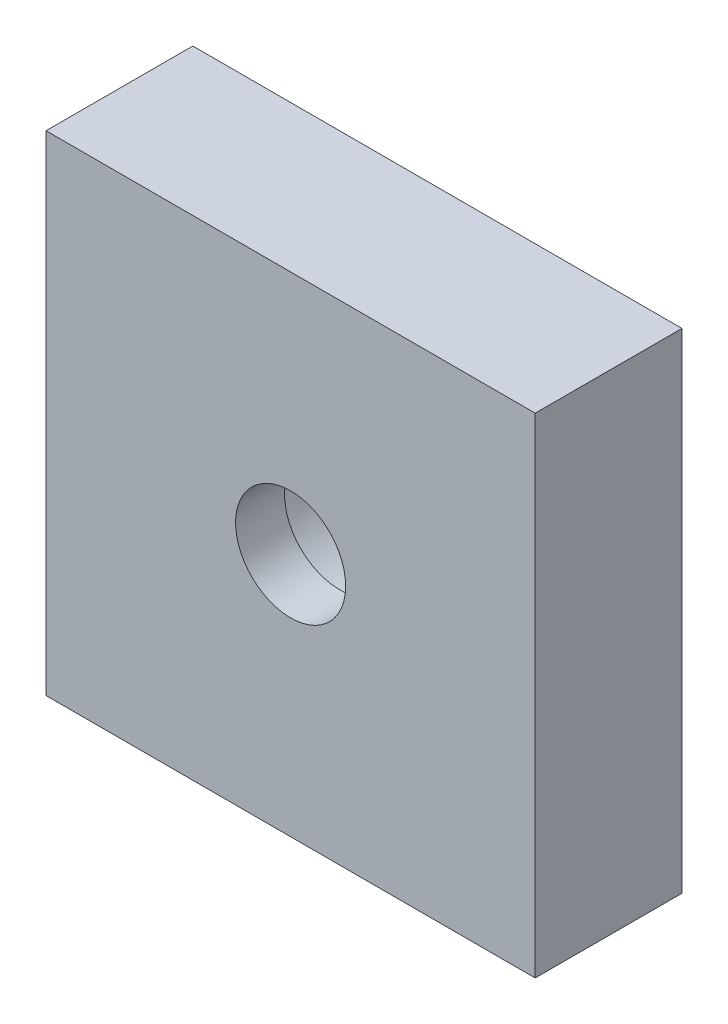
ISO-10303-21;
HEADER;
FILE_DESCRIPTION(('STEP AP214'),'2;1');
FILE_NAME('part.step','',(''),(''),'','','');
FILE_SCHEMA(('AUTOMOTIVE_DESIGN { 1 0 10303 214 1 1 1 1 }'));
ENDSEC;
DATA;
#1=APPLICATION_CONTEXT('core data for automotive mechanical design processes');
#2=APPLICATION_PROTOCOL_DEFINITION('international standard','automotive_design',2000,#1);
#3=PRODUCT_CONTEXT('',#1,'mechanical');
#4=PRODUCT('Part','Part','',(#3));
#5=PRODUCT_RELATED_PRODUCT_CATEGORY('part','',(#4));
#6=PRODUCT_DEFINITION_FORMATION('','',#4);
#7=PRODUCT_DEFINITION_CONTEXT('part definition',#1,'design');
#8=PRODUCT_DEFINITION('design','',#6,#7);
#9=PRODUCT_DEFINITION_SHAPE('','',#8);
#10=(LENGTH_UNIT() NAMED_UNIT(*) SI_UNIT(.MILLI.,.METRE.));
#11=(NAMED_UNIT(*) PLANE_ANGLE_UNIT() SI_UNIT($,.RADIAN.));
#12=(NAMED_UNIT(*) SI_UNIT($,.STERADIAN.) SOLID_ANGLE_UNIT());
#13=UNCERTAINTY_MEASURE_WITH_UNIT(LENGTH_MEASURE(1.E-05),#10,'distance_accuracy_value','');
#14=(GEOMETRIC_REPRESENTATION_CONTEXT(3) GLOBAL_UNCERTAINTY_ASSIGNED_CONTEXT((#13)) GLOBAL_UNIT_ASSIGNED_CONTEXT((#10,
#11,#12)) REPRESENTATION_CONTEXT('',''));
#15=CARTESIAN_POINT('',(0.,0.,0.));
#16=DIRECTION('',(0.,0.,1.));
#17=DIRECTION('',(1.,0.,0.));
#18=AXIS2_PLACEMENT_3D('',#15,#16,#17);
#19=CARTESIAN_POINT('',(10.,10.,10.0049));
#20=DIRECTION('',(0.,0.,1.));
#21=DIRECTION('',(1.,0.,0.));
#22=AXIS2_PLACEMENT_3D('',#19,#20,#21);
#23=PLANE('',#22);
#24=CARTESIAN_POINT('',(10.,10.,10.0049));
#25=DIRECTION('',(0.,0.,1.));
#26=DIRECTION('',(1.,0.,0.));
#27=AXIS2_PLACEMENT_3D('',#24,#25,#26);
#28=CIRCLE('',#27,3.);
#29=CARTESIAN_POINT('',(13.,10.,10.0049));
#30=VERTEX_POINT('',#29);
#31=EDGE_CURVE('E19',#30,#30,#28,.F.);
#32=ORIENTED_EDGE('',*,*,#31,.T.);
#33=EDGE_LOOP('',(#32));
#34=FACE_BOUND('',#33,.T.);
#35=ADVANCED_FACE('F16',(#34),#23,.F.);
#36=CARTESIAN_POINT('',(30.,10.,10.0049));
#37=DIRECTION('',(0.,0.,1.));
#38=DIRECTION('',(1.,0.,0.));
#39=AXIS2_PLACEMENT_3D('',#36,#37,#38);
#40=PLANE('',#39);
#41=CARTESIAN_POINT('',(30.,10.,10.0049));
#42=DIRECTION('',(0.,0.,1.));
#43=DIRECTION('',(1.,0.,0.));
#44=AXIS2_PLACEMENT_3D('',#41,#42,#43);
#45=CIRCLE('',#44,3.);
#46=CARTESIAN_POINT('',(33.,10.,10.0049));
#47=VERTEX_POINT('',#46);
#48=EDGE_CURVE('E109',#47,#47,#45,.F.);
#49=ORIENTED_EDGE('',*,*,#48,.T.);
#50=EDGE_LOOP('',(#49));
#51=FACE_BOUND('',#50,.T.);
#52=ADVANCED_FACE('F181',(#51),#40,.F.);
#53=CARTESIAN_POINT('',(10.,30.,10.0049));
#54=DIRECTION('',(0.,0.,1.));
#55=DIRECTION('',(1.,0.,0.));
#56=AXIS2_PLACEMENT_3D('',#53,#54,#55);
#57=PLANE('',#56);
#58=CARTESIAN_POINT('',(10.,30.,10.0049));
#59=DIRECTION('',(0.,0.,1.));
#60=DIRECTION('',(1.,0.,0.));
#61=AXIS2_PLACEMENT_3D('',#58,#59,#60);
#62=CIRCLE('',#61,3.);
#63=CARTESIAN_POINT('',(13.,30.,10.0049));
#64=VERTEX_POINT('',#63);
#65=EDGE_CURVE('E107',#64,#64,#62,.F.);
#66=ORIENTED_EDGE('',*,*,#65,.T.);
#67=EDGE_LOOP('',(#66));
#68=FACE_BOUND('',#67,.T.);
#69=ADVANCED_FACE('F131',(#68),#57,.F.);
#70=CARTESIAN_POINT('',(30.,30.,10.0049));
#71=DIRECTION('',(0.,0.,1.));
#72=DIRECTION('',(1.,0.,0.));
#73=AXIS2_PLACEMENT_3D('',#70,#71,#72);
#74=PLANE('',#73);
#75=CARTESIAN_POINT('',(30.,30.,10.0049));
#76=DIRECTION('',(0.,0.,1.));
#77=DIRECTION('',(1.,0.,0.));
#78=AXIS2_PLACEMENT_3D('',#75,#76,#77);
#79=CIRCLE('',#78,3.);
#80=CARTESIAN_POINT('',(33.,30.,10.0049));
#81=VERTEX_POINT('',#80);
#82=EDGE_CURVE('E104',#81,#81,#79,.F.);
#83=ORIENTED_EDGE('',*,*,#82,.T.);
#84=EDGE_LOOP('',(#83));
#85=FACE_BOUND('',#84,.T.);
#86=ADVANCED_FACE('F120',(#85),#74,.F.);
#87=CARTESIAN_POINT('',(10.,10.,0.004899999999907));
#88=DIRECTION('',(0.,0.,1.));
#89=DIRECTION('',(1.,0.,0.));
#90=AXIS2_PLACEMENT_3D('',#87,#88,#89);
#91=CYLINDRICAL_SURFACE('',#90,3.);
#92=CARTESIAN_POINT('',(10.,10.,0.004900000000021));
#93=DIRECTION('',(0.,0.,1.));
#94=DIRECTION('',(1.,0.,0.));
#95=AXIS2_PLACEMENT_3D('',#92,#93,#94);
#96=CIRCLE('',#95,3.);
#97=CARTESIAN_POINT('',(13.,10.,0.004900000000021));
#98=VERTEX_POINT('',#97);
#99=EDGE_CURVE('E101',#98,#98,#96,.F.);
#100=ORIENTED_EDGE('',*,*,#99,.T.);
#101=EDGE_LOOP('',(#100));
#102=FACE_BOUND('',#101,.T.);
#103=ORIENTED_EDGE('',*,*,#31,.F.);
#104=EDGE_LOOP('',(#103));
#105=FACE_BOUND('',#104,.T.);
#106=ADVANCED_FACE('F117',(#102,#105),#91,.F.);
#107=CARTESIAN_POINT('',(30.,10.,0.004899999999907));
#108=DIRECTION('',(0.,0.,1.));
#109=DIRECTION('',(1.,0.,0.));
#110=AXIS2_PLACEMENT_3D('',#107,#108,#109);
#111=CYLINDRICAL_SURFACE('',#110,3.);
#112=CARTESIAN_POINT('',(30.,10.,0.004900000000021));
#113=DIRECTION('',(0.,0.,1.));
#114=DIRECTION('',(1.,0.,0.));
#115=AXIS2_PLACEMENT_3D('',#112,#113,#114);
#116=CIRCLE('',#115,3.);
#117=CARTESIAN_POINT('',(33.,10.,0.004900000000021));
#118=VERTEX_POINT('',#117);
#119=EDGE_CURVE('E98',#118,#118,#116,.F.);
#120=ORIENTED_EDGE('',*,*,#119,.T.);
#121=EDGE_LOOP('',(#120));
#122=FACE_BOUND('',#121,.T.);
#123=ORIENTED_EDGE('',*,*,#48,.F.);
#124=EDGE_LOOP('',(#123));
#125=FACE_BOUND('',#124,.T.);
#126=ADVANCED_FACE('F119',(#122,#125),#111,.F.);
#127=CARTESIAN_POINT('',(10.,30.,0.004899999999907));
#128=DIRECTION('',(0.,0.,1.));
#129=DIRECTION('',(1.,0.,0.));
#130=AXIS2_PLACEMENT_3D('',#127,#128,#129);
#131=CYLINDRICAL_SURFACE('',#130,3.);
#132=CARTESIAN_POINT('',(10.,30.,0.004900000000021));
#133=DIRECTION('',(0.,0.,1.));
#134=DIRECTION('',(1.,0.,0.));
#135=AXIS2_PLACEMENT_3D('',#132,#133,#134);
#136=CIRCLE('',#135,3.);
#137=CARTESIAN_POINT('',(13.,30.,0.004900000000021));
#138=VERTEX_POINT('',#137);
#139=EDGE_CURVE('E95',#138,#138,#136,.F.);
#140=ORIENTED_EDGE('',*,*,#139,.T.);
#141=EDGE_LOOP('',(#140));
#142=FACE_BOUND('',#141,.T.);
#143=ORIENTED_EDGE('',*,*,#65,.F.);
#144=EDGE_LOOP('',(#143));
#145=FACE_BOUND('',#144,.T.);
#146=ADVANCED_FACE('F128',(#142,#145),#131,.F.);
#147=CARTESIAN_POINT('',(30.,30.,0.004899999999907));
#148=DIRECTION('',(0.,0.,1.));
#149=DIRECTION('',(1.,0.,0.));
#150=AXIS2_PLACEMENT_3D('',#147,#148,#149);
#151=CYLINDRICAL_SURFACE('',#150,3.);
#152=CARTESIAN_POINT('',(30.,30.,0.004900000000021));
#153=DIRECTION('',(0.,0.,1.));
#154=DIRECTION('',(1.,0.,0.));
#155=AXIS2_PLACEMENT_3D('',#152,#153,#154);
#156=CIRCLE('',#155,3.);
#157=CARTESIAN_POINT('',(33.,30.,0.004900000000021));
#158=VERTEX_POINT('',#157);
#159=EDGE_CURVE('E89',#158,#158,#156,.F.);
#160=ORIENTED_EDGE('',*,*,#159,.T.);
#161=EDGE_LOOP('',(#160));
#162=FACE_BOUND('',#161,.T.);
#163=ORIENTED_EDGE('',*,*,#82,.F.);
#164=EDGE_LOOP('',(#163));
#165=FACE_BOUND('',#164,.T.);
#166=ADVANCED_FACE('F167',(#162,#165),#151,.F.);
#167=CARTESIAN_POINT('',(20.,20.,0.004899999999907));
#168=DIRECTION('',(0.,0.,1.));
#169=DIRECTION('',(1.,0.,0.));
#170=AXIS2_PLACEMENT_3D('',#167,#168,#169);
#171=CYLINDRICAL_SURFACE('',#170,7.);
#172=CARTESIAN_POINT('',(20.,20.,0.004900000000021));
#173=DIRECTION('',(0.,0.,1.));
#174=DIRECTION('',(1.,0.,0.));
#175=AXIS2_PLACEMENT_3D('',#172,#173,#174);
#176=CIRCLE('',#175,7.);
#177=CARTESIAN_POINT('',(27.,20.,0.004900000000021));
#178=VERTEX_POINT('',#177);
#179=EDGE_CURVE('E92',#178,#178,#176,.F.);
#180=ORIENTED_EDGE('',*,*,#179,.T.);
#181=EDGE_LOOP('',(#180));
#182=FACE_BOUND('',#181,.T.);
#183=CARTESIAN_POINT('',(20.,20.,8.0049));
#184=DIRECTION('',(0.,0.,1.));
#185=DIRECTION('',(1.,0.,0.));
#186=AXIS2_PLACEMENT_3D('',#183,#184,#185);
#187=CIRCLE('',#186,7.);
#188=CARTESIAN_POINT('',(27.,20.,8.0049));
#189=VERTEX_POINT('',#188);
#190=EDGE_CURVE('E72',#189,#189,#187,.T.);
#191=ORIENTED_EDGE('',*,*,#190,.T.);
#192=EDGE_LOOP('',(#191));
#193=FACE_BOUND('',#192,.T.);
#194=ADVANCED_FACE('F163',(#182,#193),#171,.F.);
#195=CARTESIAN_POINT('',(0.,0.,0.004899999999907));
#196=DIRECTION('',(0.,0.,1.));
#197=DIRECTION('',(1.,0.,0.));
#198=AXIS2_PLACEMENT_3D('',#195,#196,#197);
#199=PLANE('',#198);
#200=ORIENTED_EDGE('',*,*,#159,.F.);
#201=EDGE_LOOP('',(#200));
#202=FACE_BOUND('',#201,.T.);
#203=ORIENTED_EDGE('',*,*,#179,.F.);
#204=EDGE_LOOP('',(#203));
#205=FACE_BOUND('',#204,.T.);
#206=ORIENTED_EDGE('',*,*,#139,.F.);
#207=EDGE_LOOP('',(#206));
#208=FACE_BOUND('',#207,.T.);
#209=ORIENTED_EDGE('',*,*,#119,.F.);
#210=EDGE_LOOP('',(#209));
#211=FACE_BOUND('',#210,.T.);
#212=ORIENTED_EDGE('',*,*,#99,.F.);
#213=EDGE_LOOP('',(#212));
#214=FACE_BOUND('',#213,.T.);
#215=DIRECTION('',(0.,1.,0.));
#216=VECTOR('',#215,1.);
#217=CARTESIAN_POINT('',(40.,0.,0.004900000000021));
#218=LINE('',#217,#216);
#219=CARTESIAN_POINT('',(40.,0.,0.0048999999999925));
#220=VERTEX_POINT('',#219);
#221=CARTESIAN_POINT('',(40.,40.,0.004899999999964));
#222=VERTEX_POINT('',#221);
#223=EDGE_CURVE('E62',#220,#222,#218,.T.);
#224=ORIENTED_EDGE('',*,*,#223,.F.);
#225=DIRECTION('',(1.,0.,0.));
#226=VECTOR('',#225,1.);
#227=CARTESIAN_POINT('',(0.,0.,0.004900000000021));
#228=LINE('',#227,#226);
#229=CARTESIAN_POINT('',(0.,0.,0.004899999999964));
#230=VERTEX_POINT('',#229);
#231=EDGE_CURVE('E55',#220,#230,#228,.F.);
#232=ORIENTED_EDGE('',*,*,#231,.T.);
#233=DIRECTION('',(0.,1.,0.));
#234=VECTOR('',#233,1.);
#235=CARTESIAN_POINT('',(0.,0.,0.004900000000021));
#236=LINE('',#235,#234);
#237=CARTESIAN_POINT('',(0.,40.,0.004899999999964));
#238=VERTEX_POINT('',#237);
#239=EDGE_CURVE('E60',#230,#238,#236,.T.);
#240=ORIENTED_EDGE('',*,*,#239,.T.);
#241=DIRECTION('',(1.,0.,0.));
#242=VECTOR('',#241,1.);
#243=CARTESIAN_POINT('',(0.,40.,0.004900000000021));
#244=LINE('',#243,#242);
#245=EDGE_CURVE('E314',#222,#238,#244,.F.);
#246=ORIENTED_EDGE('',*,*,#245,.F.);
#247=EDGE_LOOP('',(#224,#232,#240,#246));
#248=FACE_BOUND('',#247,.T.);
#249=ADVANCED_FACE('F59',(#202,#205,#208,#211,#214,#248),#199,.F.);
#250=CARTESIAN_POINT('',(20.,20.,8.0049));
#251=DIRECTION('',(0.,0.,1.));
#252=DIRECTION('',(1.,0.,0.));
#253=AXIS2_PLACEMENT_3D('',#250,#251,#252);
#254=PLANE('',#253);
#255=CARTESIAN_POINT('',(20.,20.,8.0049));
#256=DIRECTION('',(0.,0.,1.));
#257=DIRECTION('',(1.,0.,0.));
#258=AXIS2_PLACEMENT_3D('',#255,#256,#257);
#259=CIRCLE('',#258,4.5);
#260=CARTESIAN_POINT('',(24.5,20.,8.0049));
#261=VERTEX_POINT('',#260);
#262=EDGE_CURVE('E83',#261,#261,#259,.T.);
#263=ORIENTED_EDGE('',*,*,#262,.T.);
#264=EDGE_LOOP('',(#263));
#265=FACE_BOUND('',#264,.T.);
#266=ORIENTED_EDGE('',*,*,#190,.F.);
#267=EDGE_LOOP('',(#266));
#268=FACE_BOUND('',#267,.T.);
#269=ADVANCED_FACE('F157',(#265,#268),#254,.F.);
#270=CARTESIAN_POINT('',(0.,0.,0.004899999999907));
#271=DIRECTION('',(1.,0.,0.));
#272=DIRECTION('',(0.,0.,-1.));
#273=AXIS2_PLACEMENT_3D('',#270,#271,#272);
#274=PLANE('',#273);
#275=DIRECTION('',(0.,0.,1.));
#276=VECTOR('',#275,1.);
#277=CARTESIAN_POINT('',(0.,40.,0.004899999999907));
#278=LINE('',#277,#276);
#279=CARTESIAN_POINT('',(0.,40.,12.0049));
#280=VERTEX_POINT('',#279);
#281=EDGE_CURVE('E70',#238,#280,#278,.T.);
#282=ORIENTED_EDGE('',*,*,#281,.F.);
#283=ORIENTED_EDGE('',*,*,#239,.F.);
#284=DIRECTION('',(0.,0.,1.));
#285=VECTOR('',#284,1.);
#286=CARTESIAN_POINT('',(0.,0.,0.004899999999907));
#287=LINE('',#286,#285);
#288=CARTESIAN_POINT('',(0.,0.,12.0049));
#289=VERTEX_POINT('',#288);
#290=EDGE_CURVE('E64',#230,#289,#287,.T.);
#291=ORIENTED_EDGE('',*,*,#290,.T.);
#292=DIRECTION('',(0.,1.,0.));
#293=VECTOR('',#292,1.);
#294=CARTESIAN_POINT('',(0.,0.,12.0049));
#295=LINE('',#294,#293);
#296=EDGE_CURVE('E86',#280,#289,#295,.F.);
#297=ORIENTED_EDGE('',*,*,#296,.F.);
#298=EDGE_LOOP('',(#282,#283,#291,#297));
#299=FACE_BOUND('',#298,.T.);
#300=ADVANCED_FACE('F67',(#299),#274,.F.);
#301=CARTESIAN_POINT('',(0.,0.,0.004899999999907));
#302=DIRECTION('',(0.,1.,0.));
#303=DIRECTION('',(0.,0.,1.));
#304=AXIS2_PLACEMENT_3D('',#301,#302,#303);
#305=PLANE('',#304);
#306=DIRECTION('',(1.,0.,0.));
#307=VECTOR('',#306,1.);
#308=CARTESIAN_POINT('',(0.,0.,12.0049));
#309=LINE('',#308,#307);
#310=CARTESIAN_POINT('',(40.,0.,12.0049));
#311=VERTEX_POINT('',#310);
#312=EDGE_CURVE('E76',#289,#311,#309,.T.);
#313=ORIENTED_EDGE('',*,*,#312,.F.);
#314=ORIENTED_EDGE('',*,*,#290,.F.);
#315=ORIENTED_EDGE('',*,*,#231,.F.);
#316=DIRECTION('',(0.,0.,-1.));
#317=VECTOR('',#316,1.);
#318=CARTESIAN_POINT('',(40.,0.,0.004899999999907));
#319=LINE('',#318,#317);
#320=EDGE_CURVE('E78',#311,#220,#319,.T.);
#321=ORIENTED_EDGE('',*,*,#320,.F.);
#322=EDGE_LOOP('',(#313,#314,#315,#321));
#323=FACE_BOUND('',#322,.T.);
#324=ADVANCED_FACE('F74',(#323),#305,.F.);
#325=CARTESIAN_POINT('',(40.,0.,0.004899999999907));
#326=DIRECTION('',(1.,0.,0.));
#327=DIRECTION('',(0.,0.,-1.));
#328=AXIS2_PLACEMENT_3D('',#325,#326,#327);
#329=PLANE('',#328);
#330=DIRECTION('',(0.,0.,1.));
#331=VECTOR('',#330,1.);
#332=CARTESIAN_POINT('',(40.,40.,0.004899999999907));
#333=LINE('',#332,#331);
#334=CARTESIAN_POINT('',(40.,40.,12.0049));
#335=VERTEX_POINT('',#334);
#336=EDGE_CURVE('E34',#335,#222,#333,.F.);
#337=ORIENTED_EDGE('',*,*,#336,.F.);
#338=DIRECTION('',(0.,1.,0.));
#339=VECTOR('',#338,1.);
#340=CARTESIAN_POINT('',(40.,0.,12.0049));
#341=LINE('',#340,#339);
#342=EDGE_CURVE('E306',#311,#335,#341,.T.);
#343=ORIENTED_EDGE('',*,*,#342,.F.);
#344=ORIENTED_EDGE('',*,*,#320,.T.);
#345=ORIENTED_EDGE('',*,*,#223,.T.);
#346=EDGE_LOOP('',(#337,#343,#344,#345));
#347=FACE_BOUND('',#346,.T.);
#348=ADVANCED_FACE('F149',(#347),#329,.T.);
#349=CARTESIAN_POINT('',(0.,40.,0.004899999999907));
#350=DIRECTION('',(0.,1.,0.));
#351=DIRECTION('',(0.,0.,1.));
#352=AXIS2_PLACEMENT_3D('',#349,#350,#351);
#353=PLANE('',#352);
#354=DIRECTION('',(1.,0.,0.));
#355=VECTOR('',#354,1.);
#356=CARTESIAN_POINT('',(0.,40.,12.0049));
#357=LINE('',#356,#355);
#358=EDGE_CURVE('E25',#335,#280,#357,.F.);
#359=ORIENTED_EDGE('',*,*,#358,.F.);
#360=ORIENTED_EDGE('',*,*,#336,.T.);
#361=ORIENTED_EDGE('',*,*,#245,.T.);
#362=ORIENTED_EDGE('',*,*,#281,.T.);
#363=EDGE_LOOP('',(#359,#360,#361,#362));
#364=FACE_BOUND('',#363,.T.);
#365=ADVANCED_FACE('F142',(#364),#353,.T.);
#366=CARTESIAN_POINT('',(20.,20.,0.004899999999907));
#367=DIRECTION('',(0.,0.,1.));
#368=DIRECTION('',(1.,0.,0.));
#369=AXIS2_PLACEMENT_3D('',#366,#367,#368);
#370=CYLINDRICAL_SURFACE('',#369,4.5);
#371=CARTESIAN_POINT('',(20.,20.,12.0049));
#372=DIRECTION('',(0.,0.,1.));
#373=DIRECTION('',(1.,0.,0.));
#374=AXIS2_PLACEMENT_3D('',#371,#372,#373);
#375=CIRCLE('',#374,4.5);
#376=CARTESIAN_POINT('',(24.5,20.,12.0049));
#377=VERTEX_POINT('',#376);
#378=EDGE_CURVE('E11',#377,#377,#375,.F.);
#379=ORIENTED_EDGE('',*,*,#378,.F.);
#380=EDGE_LOOP('',(#379));
#381=FACE_BOUND('',#380,.T.);
#382=ORIENTED_EDGE('',*,*,#262,.F.);
#383=EDGE_LOOP('',(#382));
#384=FACE_BOUND('',#383,.T.);
#385=ADVANCED_FACE('F136',(#381,#384),#370,.F.);
#386=CARTESIAN_POINT('',(0.,0.,12.0049));
#387=DIRECTION('',(0.,0.,1.));
#388=DIRECTION('',(1.,0.,0.));
#389=AXIS2_PLACEMENT_3D('',#386,#387,#388);
#390=PLANE('',#389);
#391=ORIENTED_EDGE('',*,*,#378,.T.);
#392=EDGE_LOOP('',(#391));
#393=FACE_BOUND('',#392,.T.);
#394=ORIENTED_EDGE('',*,*,#342,.T.);
#395=ORIENTED_EDGE('',*,*,#358,.T.);
#396=ORIENTED_EDGE('',*,*,#296,.T.);
#397=ORIENTED_EDGE('',*,*,#312,.T.);
#398=EDGE_LOOP('',(#394,#395,#396,#397));
#399=FACE_BOUND('',#398,.T.);
#400=ADVANCED_FACE('F134',(#393,#399),#390,.T.);
#401=CLOSED_SHELL('',(#35,#52,#69,#86,#106,#126,#146,#166,#194,#249,#269,#300,#324,#348,#365,
#385,#400));
#402=MANIFOLD_SOLID_BREP('B1',#401);
#403=ADVANCED_BREP_SHAPE_REPRESENTATION('',(#18,#402),#14);
#404=SHAPE_DEFINITION_REPRESENTATION(#9,#403);
ENDSEC;
END-ISO-10303-21;
